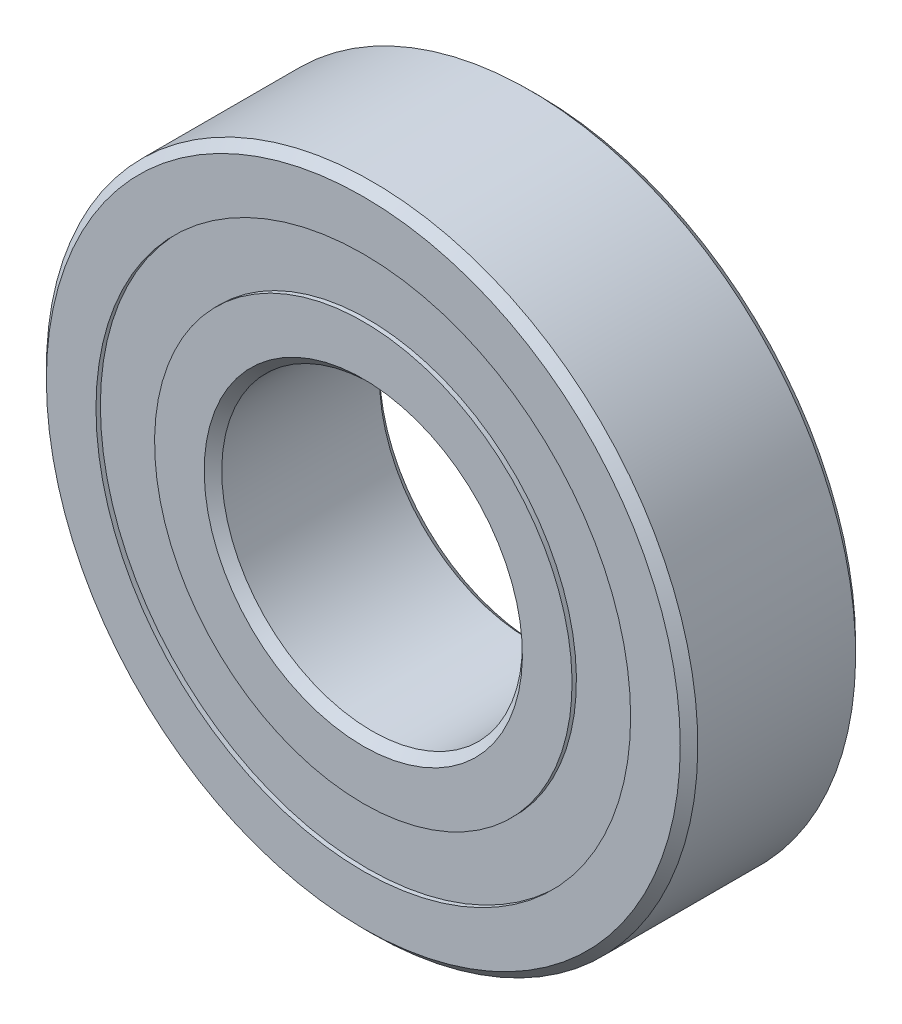
ISO-10303-21;
HEADER;
FILE_DESCRIPTION(('STEP AP214'),'2;1');
FILE_NAME('part.step','',(''),(''),'','','');
FILE_SCHEMA(('AUTOMOTIVE_DESIGN { 1 0 10303 214 1 1 1 1 }'));
ENDSEC;
DATA;
#1=APPLICATION_CONTEXT('core data for automotive mechanical design processes');
#2=APPLICATION_PROTOCOL_DEFINITION('international standard','automotive_design',2000,#1);
#3=PRODUCT_CONTEXT('',#1,'mechanical');
#4=PRODUCT('Part','Part','',(#3));
#5=PRODUCT_RELATED_PRODUCT_CATEGORY('part','',(#4));
#6=PRODUCT_DEFINITION_FORMATION('','',#4);
#7=PRODUCT_DEFINITION_CONTEXT('part definition',#1,'design');
#8=PRODUCT_DEFINITION('design','',#6,#7);
#9=PRODUCT_DEFINITION_SHAPE('','',#8);
#10=(LENGTH_UNIT() NAMED_UNIT(*) SI_UNIT(.MILLI.,.METRE.));
#11=(NAMED_UNIT(*) PLANE_ANGLE_UNIT() SI_UNIT($,.RADIAN.));
#12=(NAMED_UNIT(*) SI_UNIT($,.STERADIAN.) SOLID_ANGLE_UNIT());
#13=UNCERTAINTY_MEASURE_WITH_UNIT(LENGTH_MEASURE(1.E-05),#10,'distance_accuracy_value','');
#14=(GEOMETRIC_REPRESENTATION_CONTEXT(3) GLOBAL_UNCERTAINTY_ASSIGNED_CONTEXT((#13)) GLOBAL_UNIT_ASSIGNED_CONTEXT((#10,
#11,#12)) REPRESENTATION_CONTEXT('',''));
#15=CARTESIAN_POINT('',(0.,0.,0.));
#16=DIRECTION('',(0.,0.,1.));
#17=DIRECTION('',(1.,0.,0.));
#18=AXIS2_PLACEMENT_3D('',#15,#16,#17);
#19=CARTESIAN_POINT('',(0.,16.9374038461539,-5.2784375));
#20=DIRECTION('',(0.,0.,1.));
#21=DIRECTION('',(0.,-1.,0.));
#22=AXIS2_PLACEMENT_3D('',#19,#20,#21);
#23=PLANE('',#22);
#24=CARTESIAN_POINT('',(0.,0.,-5.27843750000001));
#25=DIRECTION('',(0.,0.,1.));
#26=DIRECTION('',(0.,-1.,0.));
#27=AXIS2_PLACEMENT_3D('',#24,#25,#26);
#28=CIRCLE('',#27,16.9374038461538);
#29=CARTESIAN_POINT('',(0.,-16.9374038461538,-5.27843750000001));
#30=VERTEX_POINT('',#29);
#31=EDGE_CURVE('E55',#30,#30,#28,.T.);
#32=ORIENTED_EDGE('',*,*,#31,.F.);
#33=EDGE_LOOP('',(#32));
#34=FACE_BOUND('',#33,.T.);
#35=CARTESIAN_POINT('',(0.,0.,-5.2784375));
#36=DIRECTION('',(0.,0.,1.));
#37=DIRECTION('',(0.,-1.,0.));
#38=AXIS2_PLACEMENT_3D('',#35,#36,#37);
#39=CIRCLE('',#38,13.2250961538461);
#40=CARTESIAN_POINT('',(0.,-13.2250961538461,-5.27843750000001));
#41=VERTEX_POINT('',#40);
#42=EDGE_CURVE('E11',#41,#41,#39,.T.);
#43=ORIENTED_EDGE('',*,*,#42,.T.);
#44=EDGE_LOOP('',(#43));
#45=FACE_BOUND('',#44,.T.);
#46=ADVANCED_FACE('F41',(#34,#45),#23,.F.);
#47=CARTESIAN_POINT('',(0.,0.,5.55625));
#48=DIRECTION('',(0.,0.,1.));
#49=DIRECTION('',(0.,-1.,0.));
#50=AXIS2_PLACEMENT_3D('',#47,#48,#49);
#51=CYLINDRICAL_SURFACE('',#50,13.2250961538461);
#52=ORIENTED_EDGE('',*,*,#42,.F.);
#53=EDGE_LOOP('',(#52));
#54=FACE_BOUND('',#53,.T.);
#55=CARTESIAN_POINT('',(0.,0.,-3.08924957955638));
#56=DIRECTION('',(0.,0.,1.));
#57=DIRECTION('',(0.,-1.,0.));
#58=AXIS2_PLACEMENT_3D('',#55,#56,#57);
#59=CIRCLE('',#58,13.2250961538461);
#60=CARTESIAN_POINT('',(0.,-13.2250961538461,-3.08924957955638));
#61=VERTEX_POINT('',#60);
#62=EDGE_CURVE('E47',#61,#61,#59,.T.);
#63=ORIENTED_EDGE('',*,*,#62,.T.);
#64=EDGE_LOOP('',(#63));
#65=FACE_BOUND('',#64,.T.);
#66=ADVANCED_FACE('F64',(#54,#65),#51,.F.);
#67=CARTESIAN_POINT('',(0.,16.9374038461539,-3.08924957955638));
#68=DIRECTION('',(0.,0.,-1.));
#69=DIRECTION('',(0.,1.,0.));
#70=AXIS2_PLACEMENT_3D('',#67,#68,#69);
#71=PLANE('',#70);
#72=ORIENTED_EDGE('',*,*,#62,.F.);
#73=EDGE_LOOP('',(#72));
#74=FACE_BOUND('',#73,.T.);
#75=CARTESIAN_POINT('',(0.,0.,-3.08924957955638));
#76=DIRECTION('',(0.,0.,1.));
#77=DIRECTION('',(0.,-1.,0.));
#78=AXIS2_PLACEMENT_3D('',#75,#76,#77);
#79=CIRCLE('',#78,16.9374038461539);
#80=CARTESIAN_POINT('',(0.,-16.9374038461539,-3.08924957955638));
#81=VERTEX_POINT('',#80);
#82=EDGE_CURVE('E51',#81,#81,#79,.T.);
#83=ORIENTED_EDGE('',*,*,#82,.T.);
#84=EDGE_LOOP('',(#83));
#85=FACE_BOUND('',#84,.T.);
#86=ADVANCED_FACE('F68',(#74,#85),#71,.F.);
#87=CARTESIAN_POINT('',(0.,0.,5.55625));
#88=DIRECTION('',(0.,0.,1.));
#89=DIRECTION('',(0.,-1.,0.));
#90=AXIS2_PLACEMENT_3D('',#87,#88,#89);
#91=CYLINDRICAL_SURFACE('',#90,16.9374038461539);
#92=ORIENTED_EDGE('',*,*,#82,.F.);
#93=EDGE_LOOP('',(#92));
#94=FACE_BOUND('',#93,.T.);
#95=ORIENTED_EDGE('',*,*,#31,.T.);
#96=EDGE_LOOP('',(#95));
#97=FACE_BOUND('',#96,.T.);
#98=ADVANCED_FACE('F61',(#94,#97),#91,.T.);
#99=CLOSED_SHELL('',(#46,#66,#86,#98));
#100=MANIFOLD_SOLID_BREP('B2',#99);
#101=CARTESIAN_POINT('',(0.,16.9374038461539,5.2784375));
#102=DIRECTION('',(0.,0.,-1.));
#103=DIRECTION('',(0.,1.,0.));
#104=AXIS2_PLACEMENT_3D('',#101,#102,#103);
#105=PLANE('',#104);
#106=CARTESIAN_POINT('',(0.,0.,5.2784375));
#107=DIRECTION('',(0.,0.,1.));
#108=DIRECTION('',(0.,-1.,0.));
#109=AXIS2_PLACEMENT_3D('',#106,#107,#108);
#110=CIRCLE('',#109,13.2250961538461);
#111=CARTESIAN_POINT('',(0.,-13.2250961538461,5.2784375));
#112=VERTEX_POINT('',#111);
#113=EDGE_CURVE('E40',#112,#112,#110,.T.);
#114=ORIENTED_EDGE('',*,*,#113,.F.);
#115=EDGE_LOOP('',(#114));
#116=FACE_BOUND('',#115,.T.);
#117=CARTESIAN_POINT('',(0.,0.,5.2784375));
#118=DIRECTION('',(0.,0.,1.));
#119=DIRECTION('',(0.,-1.,0.));
#120=AXIS2_PLACEMENT_3D('',#117,#118,#119);
#121=CIRCLE('',#120,16.9374038461539);
#122=CARTESIAN_POINT('',(0.,-16.9374038461539,5.2784375));
#123=VERTEX_POINT('',#122);
#124=EDGE_CURVE('E122',#123,#123,#121,.T.);
#125=ORIENTED_EDGE('',*,*,#124,.T.);
#126=EDGE_LOOP('',(#125));
#127=FACE_BOUND('',#126,.T.);
#128=ADVANCED_FACE('F108',(#116,#127),#105,.F.);
#129=CARTESIAN_POINT('',(0.,0.,5.55625));
#130=DIRECTION('',(0.,0.,1.));
#131=DIRECTION('',(0.,-1.,0.));
#132=AXIS2_PLACEMENT_3D('',#129,#130,#131);
#133=CYLINDRICAL_SURFACE('',#132,13.2250961538461);
#134=CARTESIAN_POINT('',(0.,0.,3.08924957955638));
#135=DIRECTION('',(0.,0.,1.));
#136=DIRECTION('',(0.,-1.,0.));
#137=AXIS2_PLACEMENT_3D('',#134,#135,#136);
#138=CIRCLE('',#137,13.2250961538461);
#139=CARTESIAN_POINT('',(0.,-13.2250961538461,3.08924957955637));
#140=VERTEX_POINT('',#139);
#141=EDGE_CURVE('E114',#140,#140,#138,.T.);
#142=ORIENTED_EDGE('',*,*,#141,.F.);
#143=EDGE_LOOP('',(#142));
#144=FACE_BOUND('',#143,.T.);
#145=ORIENTED_EDGE('',*,*,#113,.T.);
#146=EDGE_LOOP('',(#145));
#147=FACE_BOUND('',#146,.T.);
#148=ADVANCED_FACE('F137',(#144,#147),#133,.F.);
#149=CARTESIAN_POINT('',(0.,16.9374038461539,3.08924957955638));
#150=DIRECTION('',(0.,0.,1.));
#151=DIRECTION('',(0.,-1.,0.));
#152=AXIS2_PLACEMENT_3D('',#149,#150,#151);
#153=PLANE('',#152);
#154=CARTESIAN_POINT('',(0.,0.,3.08924957955638));
#155=DIRECTION('',(0.,0.,1.));
#156=DIRECTION('',(0.,-1.,0.));
#157=AXIS2_PLACEMENT_3D('',#154,#155,#156);
#158=CIRCLE('',#157,16.9374038461539);
#159=CARTESIAN_POINT('',(0.,-16.9374038461539,3.08924957955637));
#160=VERTEX_POINT('',#159);
#161=EDGE_CURVE('E118',#160,#160,#158,.T.);
#162=ORIENTED_EDGE('',*,*,#161,.F.);
#163=EDGE_LOOP('',(#162));
#164=FACE_BOUND('',#163,.T.);
#165=ORIENTED_EDGE('',*,*,#141,.T.);
#166=EDGE_LOOP('',(#165));
#167=FACE_BOUND('',#166,.T.);
#168=ADVANCED_FACE('F132',(#164,#167),#153,.F.);
#169=CARTESIAN_POINT('',(0.,0.,5.55625));
#170=DIRECTION('',(0.,0.,1.));
#171=DIRECTION('',(0.,-1.,0.));
#172=AXIS2_PLACEMENT_3D('',#169,#170,#171);
#173=CYLINDRICAL_SURFACE('',#172,16.9374038461539);
#174=ORIENTED_EDGE('',*,*,#124,.F.);
#175=EDGE_LOOP('',(#174));
#176=FACE_BOUND('',#175,.T.);
#177=ORIENTED_EDGE('',*,*,#161,.T.);
#178=EDGE_LOOP('',(#177));
#179=FACE_BOUND('',#178,.T.);
#180=ADVANCED_FACE('F129',(#176,#179),#173,.T.);
#181=CLOSED_SHELL('',(#128,#148,#168,#180));
#182=MANIFOLD_SOLID_BREP('B6',#181);
#183=CARTESIAN_POINT('',(-8.8645363361357,12.2009875464173,0.));
#184=DIRECTION('',(0.,0.,1.));
#185=DIRECTION('',(-0.587785252292462,0.809016994374955,0.));
#186=AXIS2_PLACEMENT_3D('',#183,#184,#185);
#187=SPHERICAL_SURFACE('',#186,3.08924957955638);
#188=CARTESIAN_POINT('',(-8.8645363361357,12.2009875464173,3.08924957955638));
#189=VERTEX_POINT('',#188);
#190=VERTEX_LOOP('',#189);
#191=FACE_BOUND('',#190,.T.);
#192=ADVANCED_FACE('F188',(#191),#187,.T.);
#193=CLOSED_SHELL('',(#192));
#194=MANIFOLD_SOLID_BREP('B35',#193);
#195=CARTESIAN_POINT('',(-14.3431210863762,4.66036254641734,0.));
#196=DIRECTION('',(0.,0.,1.));
#197=DIRECTION('',(-0.95105651629515,0.309016994374958,0.));
#198=AXIS2_PLACEMENT_3D('',#195,#196,#197);
#199=SPHERICAL_SURFACE('',#198,3.08924957955638);
#200=CARTESIAN_POINT('',(-14.3431210863762,4.66036254641734,3.08924957955638));
#201=VERTEX_POINT('',#200);
#202=VERTEX_LOOP('',#201);
#203=FACE_BOUND('',#202,.T.);
#204=ADVANCED_FACE('F206',(#203),#199,.T.);
#205=CLOSED_SHELL('',(#204));
#206=MANIFOLD_SOLID_BREP('B104',#205);
#207=CARTESIAN_POINT('',(-14.3431210863763,-4.66036254641704,0.));
#208=DIRECTION('',(0.,0.,1.));
#209=DIRECTION('',(-0.951056516295157,-0.309016994374938,0.));
#210=AXIS2_PLACEMENT_3D('',#207,#208,#209);
#211=SPHERICAL_SURFACE('',#210,3.08924957955638);
#212=CARTESIAN_POINT('',(-14.3431210863763,-4.66036254641704,3.08924957955638));
#213=VERTEX_POINT('',#212);
#214=VERTEX_LOOP('',#213);
#215=FACE_BOUND('',#214,.T.);
#216=ADVANCED_FACE('F224',(#215),#211,.T.);
#217=CLOSED_SHELL('',(#216));
#218=MANIFOLD_SOLID_BREP('B184',#217);
#219=CARTESIAN_POINT('',(-8.86453633613597,-12.2009875464171,0.));
#220=DIRECTION('',(0.,0.,1.));
#221=DIRECTION('',(-0.58778525229248,-0.809016994374942,0.));
#222=AXIS2_PLACEMENT_3D('',#219,#220,#221);
#223=SPHERICAL_SURFACE('',#222,3.08924957955638);
#224=CARTESIAN_POINT('',(-8.86453633613597,-12.2009875464171,3.08924957955638));
#225=VERTEX_POINT('',#224);
#226=VERTEX_LOOP('',#225);
#227=FACE_BOUND('',#226,.T.);
#228=ADVANCED_FACE('F242',(#227),#223,.T.);
#229=CLOSED_SHELL('',(#228));
#230=MANIFOLD_SOLID_BREP('B202',#229);
#231=CARTESIAN_POINT('',(0.,-15.08125,0.));
#232=DIRECTION('',(0.,0.,1.));
#233=DIRECTION('',(0.,-1.,0.));
#234=AXIS2_PLACEMENT_3D('',#231,#232,#233);
#235=SPHERICAL_SURFACE('',#234,3.08924957955638);
#236=CARTESIAN_POINT('',(0.,-15.08125,3.08924957955637));
#237=VERTEX_POINT('',#236);
#238=VERTEX_LOOP('',#237);
#239=FACE_BOUND('',#238,.T.);
#240=ADVANCED_FACE('F260',(#239),#235,.T.);
#241=CLOSED_SHELL('',(#240));
#242=MANIFOLD_SOLID_BREP('B220',#241);
#243=CARTESIAN_POINT('',(8.86453633613579,-12.2009875464172,0.));
#244=DIRECTION('',(0.,0.,1.));
#245=DIRECTION('',(0.587785252292469,-0.809016994374951,0.));
#246=AXIS2_PLACEMENT_3D('',#243,#244,#245);
#247=SPHERICAL_SURFACE('',#246,3.08924957955638);
#248=CARTESIAN_POINT('',(8.86453633613579,-12.2009875464172,3.08924957955638));
#249=VERTEX_POINT('',#248);
#250=VERTEX_LOOP('',#249);
#251=FACE_BOUND('',#250,.T.);
#252=ADVANCED_FACE('F278',(#251),#247,.T.);
#253=CLOSED_SHELL('',(#252));
#254=MANIFOLD_SOLID_BREP('B238',#253);
#255=CARTESIAN_POINT('',(14.3431210863763,-4.66036254641724,0.));
#256=DIRECTION('',(0.,0.,1.));
#257=DIRECTION('',(0.951056516295152,-0.309016994374952,0.));
#258=AXIS2_PLACEMENT_3D('',#255,#256,#257);
#259=SPHERICAL_SURFACE('',#258,3.08924957955638);
#260=CARTESIAN_POINT('',(14.3431210863763,-4.66036254641724,3.08924957955638));
#261=VERTEX_POINT('',#260);
#262=VERTEX_LOOP('',#261);
#263=FACE_BOUND('',#262,.T.);
#264=ADVANCED_FACE('F296',(#263),#259,.T.);
#265=CLOSED_SHELL('',(#264));
#266=MANIFOLD_SOLID_BREP('B256',#265);
#267=CARTESIAN_POINT('',(14.3431210863763,4.66036254641714,0.));
#268=DIRECTION('',(0.,0.,1.));
#269=DIRECTION('',(0.951056516295155,0.309016994374945,0.));
#270=AXIS2_PLACEMENT_3D('',#267,#268,#269);
#271=SPHERICAL_SURFACE('',#270,3.08924957955638);
#272=CARTESIAN_POINT('',(14.3431210863763,4.66036254641714,3.08924957955638));
#273=VERTEX_POINT('',#272);
#274=VERTEX_LOOP('',#273);
#275=FACE_BOUND('',#274,.T.);
#276=ADVANCED_FACE('F314',(#275),#271,.T.);
#277=CLOSED_SHELL('',(#276));
#278=MANIFOLD_SOLID_BREP('B274',#277);
#279=CARTESIAN_POINT('',(8.86453633613588,12.2009875464172,0.));
#280=DIRECTION('',(0.,0.,1.));
#281=DIRECTION('',(0.587785252292474,0.809016994374947,0.));
#282=AXIS2_PLACEMENT_3D('',#279,#280,#281);
#283=SPHERICAL_SURFACE('',#282,3.08924957955638);
#284=CARTESIAN_POINT('',(8.86453633613588,12.2009875464172,3.08924957955638));
#285=VERTEX_POINT('',#284);
#286=VERTEX_LOOP('',#285);
#287=FACE_BOUND('',#286,.T.);
#288=ADVANCED_FACE('F332',(#287),#283,.T.);
#289=CLOSED_SHELL('',(#288));
#290=MANIFOLD_SOLID_BREP('B292',#289);
#291=CARTESIAN_POINT('',(0.,15.08125,0.));
#292=DIRECTION('',(0.,0.,1.));
#293=DIRECTION('',(0.,1.,0.));
#294=AXIS2_PLACEMENT_3D('',#291,#292,#293);
#295=SPHERICAL_SURFACE('',#294,3.08924957955638);
#296=CARTESIAN_POINT('',(0.,15.08125,3.08924957955638));
#297=VERTEX_POINT('',#296);
#298=VERTEX_LOOP('',#297);
#299=FACE_BOUND('',#298,.T.);
#300=ADVANCED_FACE('F352',(#299),#295,.T.);
#301=CLOSED_SHELL('',(#300));
#302=MANIFOLD_SOLID_BREP('B310',#301);
#303=CARTESIAN_POINT('',(0.,10.080625,5.55625000000001));
#304=DIRECTION('',(0.,0.,-1.));
#305=DIRECTION('',(0.,1.,0.));
#306=AXIS2_PLACEMENT_3D('',#303,#304,#305);
#307=PLANE('',#306);
#308=CARTESIAN_POINT('',(0.,0.,5.55625));
#309=DIRECTION('',(0.,0.,1.));
#310=DIRECTION('',(0.,-1.,0.));
#311=AXIS2_PLACEMENT_3D('',#308,#309,#310);
#312=CIRCLE('',#311,10.080625);
#313=CARTESIAN_POINT('',(0.,-10.080625,5.55625));
#314=VERTEX_POINT('',#313);
#315=EDGE_CURVE('E399',#314,#314,#312,.T.);
#316=ORIENTED_EDGE('',*,*,#315,.F.);
#317=EDGE_LOOP('',(#316));
#318=FACE_BOUND('',#317,.T.);
#319=CARTESIAN_POINT('',(0.,0.,5.55625));
#320=DIRECTION('',(0.,0.,1.));
#321=DIRECTION('',(0.,-1.,0.));
#322=AXIS2_PLACEMENT_3D('',#319,#320,#321);
#323=CIRCLE('',#322,13.2250961538461);
#324=CARTESIAN_POINT('',(0.,-13.2250961538461,5.55625));
#325=VERTEX_POINT('',#324);
#326=EDGE_CURVE('E351',#325,#325,#323,.T.);
#327=ORIENTED_EDGE('',*,*,#326,.T.);
#328=EDGE_LOOP('',(#327));
#329=FACE_BOUND('',#328,.T.);
#330=ADVANCED_FACE('F371',(#318,#329),#307,.F.);
#331=CARTESIAN_POINT('',(0.,0.,5.55625));
#332=DIRECTION('',(0.,0.,1.));
#333=DIRECTION('',(0.,-1.,0.));
#334=AXIS2_PLACEMENT_3D('',#331,#332,#333);
#335=CYLINDRICAL_SURFACE('',#334,13.2250961538461);
#336=ORIENTED_EDGE('',*,*,#326,.F.);
#337=EDGE_LOOP('',(#336));
#338=FACE_BOUND('',#337,.T.);
#339=CARTESIAN_POINT('',(0.,0.,2.46944444444443));
#340=DIRECTION('',(0.,0.,1.));
#341=DIRECTION('',(0.,-1.,0.));
#342=AXIS2_PLACEMENT_3D('',#339,#340,#341);
#343=CIRCLE('',#342,13.2250961538461);
#344=CARTESIAN_POINT('',(0.,-13.2250961538461,2.46944444444443));
#345=VERTEX_POINT('',#344);
#346=EDGE_CURVE('E377',#345,#345,#343,.T.);
#347=ORIENTED_EDGE('',*,*,#346,.T.);
#348=EDGE_LOOP('',(#347));
#349=FACE_BOUND('',#348,.T.);
#350=ADVANCED_FACE('F406',(#338,#349),#335,.T.);
#351=CARTESIAN_POINT('',(0.,0.,0.));
#352=DIRECTION('',(0.,0.,1.));
#353=DIRECTION('',(0.,-1.,0.));
#354=AXIS2_PLACEMENT_3D('',#351,#352,#353);
#355=TOROIDAL_SURFACE('',#354,15.08125,3.08924957955638);
#356=ORIENTED_EDGE('',*,*,#346,.F.);
#357=EDGE_LOOP('',(#356));
#358=FACE_BOUND('',#357,.T.);
#359=CARTESIAN_POINT('',(0.,0.,-2.46944444444444));
#360=DIRECTION('',(0.,0.,1.));
#361=DIRECTION('',(0.,-1.,0.));
#362=AXIS2_PLACEMENT_3D('',#359,#360,#361);
#363=CIRCLE('',#362,13.2250961538461);
#364=CARTESIAN_POINT('',(0.,-13.2250961538461,-2.46944444444444));
#365=VERTEX_POINT('',#364);
#366=EDGE_CURVE('E381',#365,#365,#363,.T.);
#367=ORIENTED_EDGE('',*,*,#366,.T.);
#368=EDGE_LOOP('',(#367));
#369=FACE_BOUND('',#368,.T.);
#370=ADVANCED_FACE('F410',(#358,#369),#355,.F.);
#371=CARTESIAN_POINT('',(0.,0.,5.55625));
#372=DIRECTION('',(0.,0.,1.));
#373=DIRECTION('',(0.,-1.,0.));
#374=AXIS2_PLACEMENT_3D('',#371,#372,#373);
#375=CYLINDRICAL_SURFACE('',#374,13.2250961538461);
#376=ORIENTED_EDGE('',*,*,#366,.F.);
#377=EDGE_LOOP('',(#376));
#378=FACE_BOUND('',#377,.T.);
#379=CARTESIAN_POINT('',(0.,0.,-5.55625000000001));
#380=DIRECTION('',(0.,0.,1.));
#381=DIRECTION('',(0.,-1.,0.));
#382=AXIS2_PLACEMENT_3D('',#379,#380,#381);
#383=CIRCLE('',#382,13.2250961538461);
#384=CARTESIAN_POINT('',(0.,-13.2250961538461,-5.55625000000001));
#385=VERTEX_POINT('',#384);
#386=EDGE_CURVE('E385',#385,#385,#383,.T.);
#387=ORIENTED_EDGE('',*,*,#386,.T.);
#388=EDGE_LOOP('',(#387));
#389=FACE_BOUND('',#388,.T.);
#390=ADVANCED_FACE('F415',(#378,#389),#375,.T.);
#391=CARTESIAN_POINT('',(0.,10.080625,-5.55625000000001));
#392=DIRECTION('',(0.,0.,1.));
#393=DIRECTION('',(0.,-1.,0.));
#394=AXIS2_PLACEMENT_3D('',#391,#392,#393);
#395=PLANE('',#394);
#396=ORIENTED_EDGE('',*,*,#386,.F.);
#397=EDGE_LOOP('',(#396));
#398=FACE_BOUND('',#397,.T.);
#399=CARTESIAN_POINT('',(0.,0.,-5.55625000000001));
#400=DIRECTION('',(0.,0.,1.));
#401=DIRECTION('',(0.,-1.,0.));
#402=AXIS2_PLACEMENT_3D('',#399,#400,#401);
#403=CIRCLE('',#402,10.080625);
#404=CARTESIAN_POINT('',(0.,-10.080625,-5.55625000000001));
#405=VERTEX_POINT('',#404);
#406=EDGE_CURVE('E390',#405,#405,#403,.T.);
#407=ORIENTED_EDGE('',*,*,#406,.T.);
#408=EDGE_LOOP('',(#407));
#409=FACE_BOUND('',#408,.T.);
#410=ADVANCED_FACE('F421',(#398,#409),#395,.F.);
#411=CARTESIAN_POINT('',(0.,0.,-5.000625));
#412=DIRECTION('',(0.,0.,-1.));
#413=DIRECTION('',(0.,1.,0.));
#414=AXIS2_PLACEMENT_3D('',#411,#412,#413);
#415=CONICAL_SURFACE('',#414,9.525,0.785398163397426);
#416=ORIENTED_EDGE('',*,*,#406,.F.);
#417=EDGE_LOOP('',(#416));
#418=FACE_BOUND('',#417,.T.);
#419=CARTESIAN_POINT('',(0.,0.,-5.000625));
#420=DIRECTION('',(0.,0.,1.));
#421=DIRECTION('',(0.,-1.,0.));
#422=AXIS2_PLACEMENT_3D('',#419,#420,#421);
#423=CIRCLE('',#422,9.525);
#424=CARTESIAN_POINT('',(0.,-9.52499999999999,-5.000625));
#425=VERTEX_POINT('',#424);
#426=EDGE_CURVE('E393',#425,#425,#423,.T.);
#427=ORIENTED_EDGE('',*,*,#426,.T.);
#428=EDGE_LOOP('',(#427));
#429=FACE_BOUND('',#428,.T.);
#430=ADVANCED_FACE('F425',(#418,#429),#415,.F.);
#431=CARTESIAN_POINT('',(0.,0.,5.55625));
#432=DIRECTION('',(0.,0.,1.));
#433=DIRECTION('',(0.,-1.,0.));
#434=AXIS2_PLACEMENT_3D('',#431,#432,#433);
#435=CYLINDRICAL_SURFACE('',#434,9.525);
#436=ORIENTED_EDGE('',*,*,#426,.F.);
#437=EDGE_LOOP('',(#436));
#438=FACE_BOUND('',#437,.T.);
#439=CARTESIAN_POINT('',(0.,0.,5.000625));
#440=DIRECTION('',(0.,0.,1.));
#441=DIRECTION('',(0.,-1.,0.));
#442=AXIS2_PLACEMENT_3D('',#439,#440,#441);
#443=CIRCLE('',#442,9.525);
#444=CARTESIAN_POINT('',(0.,-9.525,5.00062499999999));
#445=VERTEX_POINT('',#444);
#446=EDGE_CURVE('E396',#445,#445,#443,.T.);
#447=ORIENTED_EDGE('',*,*,#446,.T.);
#448=EDGE_LOOP('',(#447));
#449=FACE_BOUND('',#448,.T.);
#450=ADVANCED_FACE('F429',(#438,#449),#435,.F.);
#451=CARTESIAN_POINT('',(0.,0.,5.55625));
#452=DIRECTION('',(0.,0.,1.));
#453=DIRECTION('',(0.,-1.,0.));
#454=AXIS2_PLACEMENT_3D('',#451,#452,#453);
#455=CONICAL_SURFACE('',#454,10.080625,0.785398163397426);
#456=ORIENTED_EDGE('',*,*,#446,.F.);
#457=EDGE_LOOP('',(#456));
#458=FACE_BOUND('',#457,.T.);
#459=ORIENTED_EDGE('',*,*,#315,.T.);
#460=EDGE_LOOP('',(#459));
#461=FACE_BOUND('',#460,.T.);
#462=ADVANCED_FACE('F403',(#458,#461),#455,.F.);
#463=CLOSED_SHELL('',(#330,#350,#370,#390,#410,#430,#450,#462));
#464=MANIFOLD_SOLID_BREP('B328',#463);
#465=CARTESIAN_POINT('',(0.,0.,5.55625));
#466=DIRECTION('',(0.,0.,1.));
#467=DIRECTION('',(0.,-1.,0.));
#468=AXIS2_PLACEMENT_3D('',#465,#466,#467);
#469=CYLINDRICAL_SURFACE('',#468,20.6375);
#470=CARTESIAN_POINT('',(0.,0.,5.000625));
#471=DIRECTION('',(0.,0.,1.));
#472=DIRECTION('',(0.,-1.,0.));
#473=AXIS2_PLACEMENT_3D('',#470,#471,#472);
#474=CIRCLE('',#473,20.6375);
#475=CARTESIAN_POINT('',(0.,-20.6375,5.00062499999999));
#476=VERTEX_POINT('',#475);
#477=EDGE_CURVE('E370',#476,#476,#474,.T.);
#478=ORIENTED_EDGE('',*,*,#477,.F.);
#479=EDGE_LOOP('',(#478));
#480=FACE_BOUND('',#479,.T.);
#481=CARTESIAN_POINT('',(0.,0.,-5.000625));
#482=DIRECTION('',(0.,0.,1.));
#483=DIRECTION('',(0.,-1.,0.));
#484=AXIS2_PLACEMENT_3D('',#481,#482,#483);
#485=CIRCLE('',#484,20.6375);
#486=CARTESIAN_POINT('',(0.,-20.6375,-5.000625));
#487=VERTEX_POINT('',#486);
#488=EDGE_CURVE('E520',#487,#487,#485,.T.);
#489=ORIENTED_EDGE('',*,*,#488,.T.);
#490=EDGE_LOOP('',(#489));
#491=FACE_BOUND('',#490,.T.);
#492=ADVANCED_FACE('F492',(#480,#491),#469,.T.);
#493=CARTESIAN_POINT('',(0.,0.,5.000625));
#494=DIRECTION('',(0.,0.,-1.));
#495=DIRECTION('',(0.,1.,0.));
#496=AXIS2_PLACEMENT_3D('',#493,#494,#495);
#497=CONICAL_SURFACE('',#496,20.6375,0.785398163397442);
#498=CARTESIAN_POINT('',(0.,0.,5.55625));
#499=DIRECTION('',(0.,0.,1.));
#500=DIRECTION('',(0.,-1.,0.));
#501=AXIS2_PLACEMENT_3D('',#498,#499,#500);
#502=CIRCLE('',#501,20.081875);
#503=CARTESIAN_POINT('',(0.,-20.081875,5.55625));
#504=VERTEX_POINT('',#503);
#505=EDGE_CURVE('E498',#504,#504,#502,.T.);
#506=ORIENTED_EDGE('',*,*,#505,.F.);
#507=EDGE_LOOP('',(#506));
#508=FACE_BOUND('',#507,.T.);
#509=ORIENTED_EDGE('',*,*,#477,.T.);
#510=EDGE_LOOP('',(#509));
#511=FACE_BOUND('',#510,.T.);
#512=ADVANCED_FACE('F557',(#508,#511),#497,.T.);
#513=CARTESIAN_POINT('',(0.,20.081875,5.55625));
#514=DIRECTION('',(0.,0.,-1.));
#515=DIRECTION('',(0.,1.,0.));
#516=AXIS2_PLACEMENT_3D('',#513,#514,#515);
#517=PLANE('',#516);
#518=CARTESIAN_POINT('',(0.,0.,5.55625));
#519=DIRECTION('',(0.,0.,1.));
#520=DIRECTION('',(0.,-1.,0.));
#521=AXIS2_PLACEMENT_3D('',#518,#519,#520);
#522=CIRCLE('',#521,16.9374038461539);
#523=CARTESIAN_POINT('',(0.,-16.9374038461539,5.55625));
#524=VERTEX_POINT('',#523);
#525=EDGE_CURVE('E502',#524,#524,#522,.T.);
#526=ORIENTED_EDGE('',*,*,#525,.F.);
#527=EDGE_LOOP('',(#526));
#528=FACE_BOUND('',#527,.T.);
#529=ORIENTED_EDGE('',*,*,#505,.T.);
#530=EDGE_LOOP('',(#529));
#531=FACE_BOUND('',#530,.T.);
#532=ADVANCED_FACE('F552',(#528,#531),#517,.F.);
#533=CARTESIAN_POINT('',(0.,0.,5.55625));
#534=DIRECTION('',(0.,0.,1.));
#535=DIRECTION('',(0.,-1.,0.));
#536=AXIS2_PLACEMENT_3D('',#533,#534,#535);
#537=CYLINDRICAL_SURFACE('',#536,16.9374038461539);
#538=CARTESIAN_POINT('',(0.,0.,2.46944444444444));
#539=DIRECTION('',(0.,0.,1.));
#540=DIRECTION('',(0.,-1.,0.));
#541=AXIS2_PLACEMENT_3D('',#538,#539,#540);
#542=CIRCLE('',#541,16.9374038461539);
#543=CARTESIAN_POINT('',(0.,-16.9374038461539,2.46944444444444));
#544=VERTEX_POINT('',#543);
#545=EDGE_CURVE('E506',#544,#544,#542,.T.);
#546=ORIENTED_EDGE('',*,*,#545,.F.);
#547=EDGE_LOOP('',(#546));
#548=FACE_BOUND('',#547,.T.);
#549=ORIENTED_EDGE('',*,*,#525,.T.);
#550=EDGE_LOOP('',(#549));
#551=FACE_BOUND('',#550,.T.);
#552=ADVANCED_FACE('F546',(#548,#551),#537,.F.);
#553=CARTESIAN_POINT('',(0.,0.,0.));
#554=DIRECTION('',(0.,0.,1.));
#555=DIRECTION('',(0.,-1.,0.));
#556=AXIS2_PLACEMENT_3D('',#553,#554,#555);
#557=TOROIDAL_SURFACE('',#556,15.08125,3.08924957955638);
#558=CARTESIAN_POINT('',(0.,0.,-2.46944444444445));
#559=DIRECTION('',(0.,0.,1.));
#560=DIRECTION('',(0.,-1.,0.));
#561=AXIS2_PLACEMENT_3D('',#558,#559,#560);
#562=CIRCLE('',#561,16.9374038461539);
#563=CARTESIAN_POINT('',(0.,-16.9374038461539,-2.46944444444445));
#564=VERTEX_POINT('',#563);
#565=EDGE_CURVE('E511',#564,#564,#562,.T.);
#566=ORIENTED_EDGE('',*,*,#565,.F.);
#567=EDGE_LOOP('',(#566));
#568=FACE_BOUND('',#567,.T.);
#569=ORIENTED_EDGE('',*,*,#545,.T.);
#570=EDGE_LOOP('',(#569));
#571=FACE_BOUND('',#570,.T.);
#572=ADVANCED_FACE('F540',(#568,#571),#557,.F.);
#573=CARTESIAN_POINT('',(0.,0.,5.55625));
#574=DIRECTION('',(0.,0.,1.));
#575=DIRECTION('',(0.,-1.,0.));
#576=AXIS2_PLACEMENT_3D('',#573,#574,#575);
#577=CYLINDRICAL_SURFACE('',#576,16.9374038461539);
#578=CARTESIAN_POINT('',(0.,0.,-5.55625));
#579=DIRECTION('',(0.,0.,1.));
#580=DIRECTION('',(0.,-1.,0.));
#581=AXIS2_PLACEMENT_3D('',#578,#579,#580);
#582=CIRCLE('',#581,16.9374038461538);
#583=CARTESIAN_POINT('',(0.,-16.9374038461538,-5.55625000000001));
#584=VERTEX_POINT('',#583);
#585=EDGE_CURVE('E514',#584,#584,#582,.T.);
#586=ORIENTED_EDGE('',*,*,#585,.F.);
#587=EDGE_LOOP('',(#586));
#588=FACE_BOUND('',#587,.T.);
#589=ORIENTED_EDGE('',*,*,#565,.T.);
#590=EDGE_LOOP('',(#589));
#591=FACE_BOUND('',#590,.T.);
#592=ADVANCED_FACE('F534',(#588,#591),#577,.F.);
#593=CARTESIAN_POINT('',(0.,20.081875,-5.55625));
#594=DIRECTION('',(0.,0.,1.));
#595=DIRECTION('',(0.,-1.,0.));
#596=AXIS2_PLACEMENT_3D('',#593,#594,#595);
#597=PLANE('',#596);
#598=CARTESIAN_POINT('',(0.,0.,-5.55625));
#599=DIRECTION('',(0.,0.,1.));
#600=DIRECTION('',(0.,-1.,0.));
#601=AXIS2_PLACEMENT_3D('',#598,#599,#600);
#602=CIRCLE('',#601,20.081875);
#603=CARTESIAN_POINT('',(0.,-20.081875,-5.55625));
#604=VERTEX_POINT('',#603);
#605=EDGE_CURVE('E517',#604,#604,#602,.T.);
#606=ORIENTED_EDGE('',*,*,#605,.F.);
#607=EDGE_LOOP('',(#606));
#608=FACE_BOUND('',#607,.T.);
#609=ORIENTED_EDGE('',*,*,#585,.T.);
#610=EDGE_LOOP('',(#609));
#611=FACE_BOUND('',#610,.T.);
#612=ADVANCED_FACE('F528',(#608,#611),#597,.F.);
#613=CARTESIAN_POINT('',(0.,0.,-5.55625));
#614=DIRECTION('',(0.,0.,1.));
#615=DIRECTION('',(0.,-1.,0.));
#616=AXIS2_PLACEMENT_3D('',#613,#614,#615);
#617=CONICAL_SURFACE('',#616,20.081875,0.785398163397442);
#618=ORIENTED_EDGE('',*,*,#488,.F.);
#619=EDGE_LOOP('',(#618));
#620=FACE_BOUND('',#619,.T.);
#621=ORIENTED_EDGE('',*,*,#605,.T.);
#622=EDGE_LOOP('',(#621));
#623=FACE_BOUND('',#622,.T.);
#624=ADVANCED_FACE('F525',(#620,#623),#617,.T.);
#625=CLOSED_SHELL('',(#492,#512,#532,#552,#572,#592,#612,#624));
#626=MANIFOLD_SOLID_BREP('B346',#625);
#627=ADVANCED_BREP_SHAPE_REPRESENTATION('',(#18,#100,#182,#194,#206,#218,#230,#242,#254,#266,
#278,#290,#302,#464,#626),#14);
#628=SHAPE_DEFINITION_REPRESENTATION(#9,#627);
ENDSEC;
END-ISO-10303-21;
